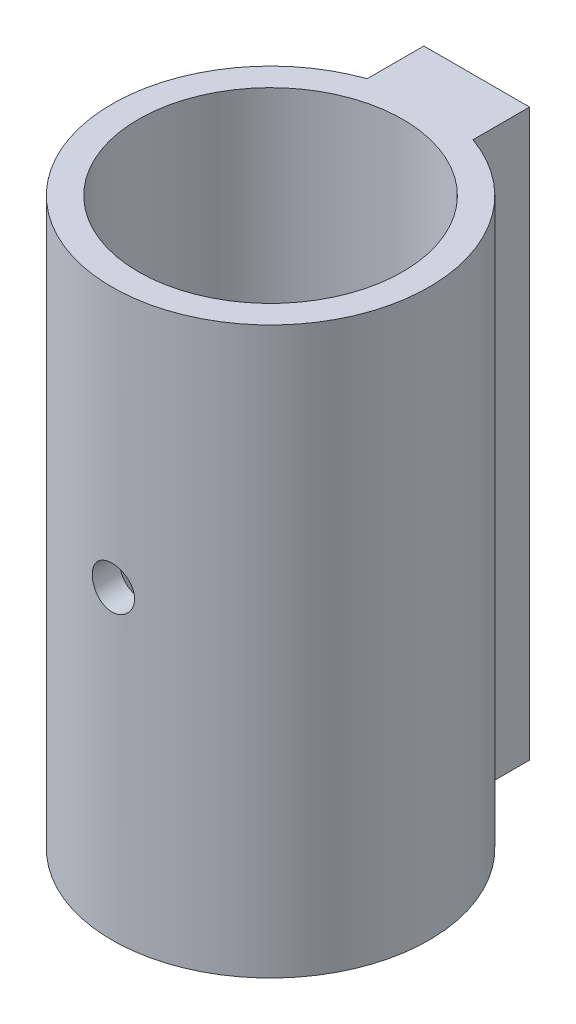
ISO-10303-21;
HEADER;
FILE_DESCRIPTION(('STEP AP214'),'2;1');
FILE_NAME('part.step','',(''),(''),'','','');
FILE_SCHEMA(('AUTOMOTIVE_DESIGN { 1 0 10303 214 1 1 1 1 }'));
ENDSEC;
DATA;
#1=APPLICATION_CONTEXT('core data for automotive mechanical design processes');
#2=APPLICATION_PROTOCOL_DEFINITION('international standard','automotive_design',2000,#1);
#3=PRODUCT_CONTEXT('',#1,'mechanical');
#4=PRODUCT('Part','Part','',(#3));
#5=PRODUCT_RELATED_PRODUCT_CATEGORY('part','',(#4));
#6=PRODUCT_DEFINITION_FORMATION('','',#4);
#7=PRODUCT_DEFINITION_CONTEXT('part definition',#1,'design');
#8=PRODUCT_DEFINITION('design','',#6,#7);
#9=PRODUCT_DEFINITION_SHAPE('','',#8);
#10=(LENGTH_UNIT() NAMED_UNIT(*) SI_UNIT(.MILLI.,.METRE.));
#11=(NAMED_UNIT(*) PLANE_ANGLE_UNIT() SI_UNIT($,.RADIAN.));
#12=(NAMED_UNIT(*) SI_UNIT($,.STERADIAN.) SOLID_ANGLE_UNIT());
#13=UNCERTAINTY_MEASURE_WITH_UNIT(LENGTH_MEASURE(1.E-05),#10,'distance_accuracy_value','');
#14=(GEOMETRIC_REPRESENTATION_CONTEXT(3) GLOBAL_UNCERTAINTY_ASSIGNED_CONTEXT((#13)) GLOBAL_UNIT_ASSIGNED_CONTEXT((#10,
#11,#12)) REPRESENTATION_CONTEXT('',''));
#15=CARTESIAN_POINT('',(0.,0.,0.));
#16=DIRECTION('',(0.,0.,1.));
#17=DIRECTION('',(1.,0.,0.));
#18=AXIS2_PLACEMENT_3D('',#15,#16,#17);
#19=CARTESIAN_POINT('',(0.,21.4,-7.8));
#20=DIRECTION('',(0.,0.,1.));
#21=DIRECTION('',(1.,0.,0.));
#22=AXIS2_PLACEMENT_3D('',#19,#20,#21);
#23=PLANE('',#22);
#24=CARTESIAN_POINT('',(0.,11.5544489743092,-7.8));
#25=DIRECTION('',(0.,0.,-1.));
#26=DIRECTION('',(-1.,0.,0.));
#27=AXIS2_PLACEMENT_3D('',#24,#25,#26);
#28=CIRCLE('',#27,1.99);
#29=CARTESIAN_POINT('',(-1.99,11.5544489743092,-7.8));
#30=VERTEX_POINT('',#29);
#31=EDGE_CURVE('E152',#30,#30,#28,.T.);
#32=ORIENTED_EDGE('',*,*,#31,.F.);
#33=EDGE_LOOP('',(#32));
#34=FACE_BOUND('',#33,.T.);
#35=DIRECTION('',(-1.,0.,0.));
#36=VECTOR('',#35,1.);
#37=CARTESIAN_POINT('',(0.,0.,-7.8));
#38=LINE('',#37,#36);
#39=CARTESIAN_POINT('',(2.,0.,-7.8));
#40=VERTEX_POINT('',#39);
#41=CARTESIAN_POINT('',(-2.,0.,-7.8));
#42=VERTEX_POINT('',#41);
#43=EDGE_CURVE('E88',#40,#42,#38,.T.);
#44=ORIENTED_EDGE('',*,*,#43,.T.);
#45=DIRECTION('',(0.,-1.,0.));
#46=VECTOR('',#45,1.);
#47=CARTESIAN_POINT('',(-2.,21.4,-7.8));
#48=LINE('',#47,#46);
#49=CARTESIAN_POINT('',(-2.,21.4,-7.8));
#50=VERTEX_POINT('',#49);
#51=EDGE_CURVE('E11',#50,#42,#48,.T.);
#52=ORIENTED_EDGE('',*,*,#51,.F.);
#53=DIRECTION('',(-1.,0.,0.));
#54=VECTOR('',#53,1.);
#55=CARTESIAN_POINT('',(0.,21.4,-7.8));
#56=LINE('',#55,#54);
#57=CARTESIAN_POINT('',(2.,21.4,-7.8));
#58=VERTEX_POINT('',#57);
#59=EDGE_CURVE('E93',#58,#50,#56,.T.);
#60=ORIENTED_EDGE('',*,*,#59,.F.);
#61=DIRECTION('',(0.,-1.,0.));
#62=VECTOR('',#61,1.);
#63=CARTESIAN_POINT('',(2.,21.4,-7.8));
#64=LINE('',#63,#62);
#65=EDGE_CURVE('E109',#58,#40,#64,.T.);
#66=ORIENTED_EDGE('',*,*,#65,.T.);
#67=EDGE_LOOP('',(#44,#52,#60,#66));
#68=FACE_BOUND('',#67,.T.);
#69=ADVANCED_FACE('F41',(#34,#68),#23,.F.);
#70=CARTESIAN_POINT('',(-2.,21.4,-7.8));
#71=DIRECTION('',(1.,0.,0.));
#72=DIRECTION('',(0.,0.,-1.));
#73=AXIS2_PLACEMENT_3D('',#70,#71,#72);
#74=PLANE('',#73);
#75=DIRECTION('',(0.,0.,1.));
#76=VECTOR('',#75,1.);
#77=CARTESIAN_POINT('',(-2.,0.,-7.8));
#78=LINE('',#77,#76);
#79=CARTESIAN_POINT('',(-2.,0.,-5.65685424949238));
#80=VERTEX_POINT('',#79);
#81=EDGE_CURVE('E104',#42,#80,#78,.T.);
#82=ORIENTED_EDGE('',*,*,#81,.T.);
#83=DIRECTION('',(0.,-1.,0.));
#84=VECTOR('',#83,1.);
#85=CARTESIAN_POINT('',(-2.,21.4,-5.65685424949238));
#86=LINE('',#85,#84);
#87=CARTESIAN_POINT('',(-2.,21.4,-5.65685424949238));
#88=VERTEX_POINT('',#87);
#89=EDGE_CURVE('E55',#88,#80,#86,.T.);
#90=ORIENTED_EDGE('',*,*,#89,.F.);
#91=DIRECTION('',(0.,0.,1.));
#92=VECTOR('',#91,1.);
#93=CARTESIAN_POINT('',(-2.,21.4,-7.8));
#94=LINE('',#93,#92);
#95=EDGE_CURVE('E96',#50,#88,#94,.T.);
#96=ORIENTED_EDGE('',*,*,#95,.F.);
#97=ORIENTED_EDGE('',*,*,#51,.T.);
#98=EDGE_LOOP('',(#82,#90,#96,#97));
#99=FACE_BOUND('',#98,.T.);
#100=ADVANCED_FACE('F103',(#99),#74,.F.);
#101=CARTESIAN_POINT('',(0.,21.4,0.));
#102=DIRECTION('',(0.,-1.,0.));
#103=DIRECTION('',(0.,0.,-1.));
#104=AXIS2_PLACEMENT_3D('',#101,#102,#103);
#105=CYLINDRICAL_SURFACE('',#104,6.);
#106=CARTESIAN_POINT('',(0.,10.7544489743092,6.));
#107=CARTESIAN_POINT('',(-0.0447235342677136,10.754450858192,5.99999934297018));
#108=CARTESIAN_POINT('',(-0.0894743917105119,10.7582119894942,5.99949468290877));
#109=CARTESIAN_POINT('',(-0.177729090055231,10.7731555139291,5.99753004450762));
#110=CARTESIAN_POINT('',(-0.221231608933214,10.7843454922681,5.99606908976689));
#111=CARTESIAN_POINT('',(-0.305699325050793,10.8138096613258,5.99235631939627));
#112=CARTESIAN_POINT('',(-0.346666273223397,10.8320788987246,5.99010505684389));
#113=CARTESIAN_POINT('',(-0.424945558012119,10.8751717398318,5.98506154664157));
#114=CARTESIAN_POINT('',(-0.46225848253481,10.8999942867758,5.98226938623426));
#115=CARTESIAN_POINT('',(-0.532410329001871,10.9556542789509,5.97643597915986));
#116=CARTESIAN_POINT('',(-0.565223194198345,10.9865244323126,5.97339343264844));
#117=CARTESIAN_POINT('',(-0.625218942692406,11.0533330499399,5.9674125502318));
#118=CARTESIAN_POINT('',(-0.652401527988885,11.0892717823076,5.96447421984937));
#119=CARTESIAN_POINT('',(-0.70046360907563,11.1653686234873,5.95902174176076));
#120=CARTESIAN_POINT('',(-0.721318429930311,11.2055424473007,5.95650927106305));
#121=CARTESIAN_POINT('',(-0.755975380029161,11.288861401204,5.95221034951693));
#122=CARTESIAN_POINT('',(-0.769777812981111,11.3320064032506,5.95042386740483));
#123=CARTESIAN_POINT('',(-0.789858427088695,11.4197712985099,5.94779174627467));
#124=CARTESIAN_POINT('',(-0.796180816914026,11.4643809081224,5.94694058148054));
#125=CARTESIAN_POINT('',(-0.801258722192469,11.5540354461516,5.94625860643726));
#126=CARTESIAN_POINT('',(-0.800014582534405,11.5990803546336,5.9464277496816));
#127=CARTESIAN_POINT('',(-0.790030983756938,11.6880174263204,5.94776222309196));
#128=CARTESIAN_POINT('',(-0.781340390127047,11.7319151862635,5.94892105848937));
#129=CARTESIAN_POINT('',(-0.756786898537486,11.8176237090133,5.95209421109898));
#130=CARTESIAN_POINT('',(-0.740923837045829,11.8594344242112,5.95410854781651));
#131=CARTESIAN_POINT('',(-0.702423716572765,11.9399328281921,5.9587730444441));
#132=CARTESIAN_POINT('',(-0.679765591654997,11.978610322787,5.9614251764956));
#133=CARTESIAN_POINT('',(-0.628333573377157,12.0516326070763,5.96706494487974));
#134=CARTESIAN_POINT('',(-0.59955936200954,12.0859771713309,5.97005259865412));
#135=CARTESIAN_POINT('',(-0.53644196010545,12.149642179342,5.97605559693434));
#136=CARTESIAN_POINT('',(-0.502056682810579,12.1789209113902,5.97907097416479));
#137=CARTESIAN_POINT('',(-0.428837668053363,12.2312977922806,5.98476769527305));
#138=CARTESIAN_POINT('',(-0.390003917776948,12.2543959233187,5.98744903818862));
#139=CARTESIAN_POINT('',(-0.308956887892188,12.2937566213871,5.99217757497432));
#140=CARTESIAN_POINT('',(-0.266742231536493,12.3100163867278,5.99422450883583));
#141=CARTESIAN_POINT('',(-0.1801483697345,12.3352047018982,5.99745130361628));
#142=CARTESIAN_POINT('',(-0.135769279816903,12.344133642565,5.99863121075972));
#143=CARTESIAN_POINT('',(-0.0464667613302583,12.3543523474177,5.99998496550743));
#144=CARTESIAN_POINT('',(-0.00155001381881778,12.3556995350226,6.00016637539618));
#145=CARTESIAN_POINT('',(0.0878686468874864,12.3508683086584,5.99952316615407));
#146=CARTESIAN_POINT('',(0.132370570138265,12.3446900775963,5.9986985714744));
#147=CARTESIAN_POINT('',(0.219525486229175,12.3250311129557,5.9961407014324));
#148=CARTESIAN_POINT('',(0.262184806604818,12.3115779469804,5.99441085721168));
#149=CARTESIAN_POINT('',(0.344642039517424,12.2777797879344,5.99023603701715));
#150=CARTESIAN_POINT('',(0.384439842806255,12.2574345319039,5.98779103375776));
#151=CARTESIAN_POINT('',(0.460299551446431,12.2102921120759,5.9824393494803));
#152=CARTESIAN_POINT('',(0.496338325758641,12.1834580280239,5.97953006018286));
#153=CARTESIAN_POINT('',(0.563421178796758,12.1241516426195,5.97358291483993));
#154=CARTESIAN_POINT('',(0.594465030649514,12.0916790853027,5.97054505296248));
#155=CARTESIAN_POINT('',(0.650882197692393,12.0217637172534,5.96465960989404));
#156=CARTESIAN_POINT('',(0.676217310435753,11.984289947614,5.96181339510119));
#157=CARTESIAN_POINT('',(0.720233404315256,11.9055852101969,5.95665653200727));
#158=CARTESIAN_POINT('',(0.738914534041386,11.8643543263451,5.95434587174714));
#159=CARTESIAN_POINT('',(0.769031346002985,11.7794260774982,5.95053124712031));
#160=CARTESIAN_POINT('',(0.780488115387182,11.7357363002249,5.94902493693039));
#161=CARTESIAN_POINT('',(0.795898668575835,11.6470315214577,5.94698299479317));
#162=CARTESIAN_POINT('',(0.799852853707127,11.6020165909795,5.94644731092537));
#163=CARTESIAN_POINT('',(0.800137943224758,11.5123195779678,5.94640892518179));
#164=CARTESIAN_POINT('',(0.796528876777971,11.4676376779235,5.94689808913008));
#165=CARTESIAN_POINT('',(0.781917506746757,11.3795218242677,5.94883673549679));
#166=CARTESIAN_POINT('',(0.770915205933074,11.3360878701885,5.95028621755532));
#167=CARTESIAN_POINT('',(0.741849241328829,11.2517115010086,5.95397956109105));
#168=CARTESIAN_POINT('',(0.723788883276164,11.2107679298625,5.9562230506376));
#169=CARTESIAN_POINT('',(0.681125371038949,11.1324826207788,5.96125218285129));
#170=CARTESIAN_POINT('',(0.656522090521714,11.0951409524068,5.96403783598641));
#171=CARTESIAN_POINT('',(0.601249794038033,11.0248131143379,5.96986386873225));
#172=CARTESIAN_POINT('',(0.570536108907603,10.9918621952072,5.97290602301633));
#173=CARTESIAN_POINT('',(0.504008677399294,10.9315596877646,5.97888687600665));
#174=CARTESIAN_POINT('',(0.46819373629191,10.9042094148091,5.98182555027591));
#175=CARTESIAN_POINT('',(0.392301195141128,10.8557821189226,5.98728254055012));
#176=CARTESIAN_POINT('',(0.352205848297585,10.8347327076871,5.98979898570756));
#177=CARTESIAN_POINT('',(0.26903696383493,10.7996967348912,5.99410928263589));
#178=CARTESIAN_POINT('',(0.225966671587955,10.7857026108593,5.99590390769725));
#179=CARTESIAN_POINT('',(0.152235363239367,10.7684697717552,5.99814288697306));
#180=CARTESIAN_POINT('',(0.122036432782311,10.7632196768998,5.9988358545403));
#181=CARTESIAN_POINT('',(0.0612292686464442,10.7562086486431,5.99976463396308));
#182=CARTESIAN_POINT('',(0.0306210385804959,10.7544476844638,6.0000004498512));
#183=CARTESIAN_POINT('',(0.,10.7544489743092,6.));
#184=B_SPLINE_CURVE_WITH_KNOTS('',3,(#106,#107,#108,#109,#110,#111,#112,#113,#114,#115,#116,
#117,#118,#119,#120,#121,#122,#123,#124,#125,#126,#127,#128,#129,#130,#131,#132,#133,#134,#135,
#136,#137,#138,#139,#140,#141,#142,#143,#144,#145,#146,#147,#148,#149,#150,#151,#152,#153,#154,
#155,#156,#157,#158,#159,#160,#161,#162,#163,#164,#165,#166,#167,#168,#169,#170,#171,#172,#173,
#174,#175,#176,#177,#178,#179,#180,#181,#182,#183),.UNSPECIFIED.,.T.,.F.,(4,2,2,2,2,2,2,2,2,2,2,
2,2,2,2,2,2,2,2,2,2,2,2,2,2,2,2,2,2,2,2,2,2,2,2,2,2,2,4),(0.,0.134058740522297,
0.268254572354018,0.402356677130961,0.536437170256137,0.671263913774235,0.806097791619343,
0.94145088604659,1.07679815106482,1.21134142365744,1.34587856369968,1.47953954039217,
1.6132035647034,1.74728633255159,1.88137607377519,2.0165221779394,2.15166867140918,
2.28687048081015,2.42206508156697,2.55623433996824,2.69040033741791,2.82406145358585,
2.95772767001418,3.09217309907954,3.22662463303505,3.3619508181418,3.49727398109219,
3.63220029894182,3.76711939913454,3.9009717099865,4.03482397067498,4.16861361481049,
4.30240584238361,4.43721467134043,4.57205512500464,4.70747810669806,4.84275561996967,
4.93454295618923,5.02632948274175),.UNSPECIFIED.);
#185=CARTESIAN_POINT('',(0.,10.7544489743092,6.));
#186=VERTEX_POINT('',#185);
#187=EDGE_CURVE('E144',#186,#186,#184,.T.);
#188=ORIENTED_EDGE('',*,*,#187,.T.);
#189=EDGE_LOOP('',(#188));
#190=FACE_BOUND('',#189,.T.);
#191=CARTESIAN_POINT('',(0.,0.,0.));
#192=DIRECTION('',(0.,1.,0.));
#193=DIRECTION('',(0.,0.,1.));
#194=AXIS2_PLACEMENT_3D('',#191,#192,#193);
#195=CIRCLE('',#194,6.);
#196=CARTESIAN_POINT('',(1.99999999999999,0.,-5.65685424949238));
#197=VERTEX_POINT('',#196);
#198=EDGE_CURVE('E81',#80,#197,#195,.T.);
#199=ORIENTED_EDGE('',*,*,#198,.T.);
#200=DIRECTION('',(0.,-1.,0.));
#201=VECTOR('',#200,1.);
#202=CARTESIAN_POINT('',(1.99999999999999,21.4,-5.65685424949238));
#203=LINE('',#202,#201);
#204=CARTESIAN_POINT('',(1.99999999999999,21.4,-5.65685424949238));
#205=VERTEX_POINT('',#204);
#206=EDGE_CURVE('E105',#205,#197,#203,.T.);
#207=ORIENTED_EDGE('',*,*,#206,.F.);
#208=CARTESIAN_POINT('',(0.,21.4,0.));
#209=DIRECTION('',(0.,1.,0.));
#210=DIRECTION('',(0.,0.,1.));
#211=AXIS2_PLACEMENT_3D('',#208,#209,#210);
#212=CIRCLE('',#211,6.);
#213=EDGE_CURVE('E100',#88,#205,#212,.T.);
#214=ORIENTED_EDGE('',*,*,#213,.F.);
#215=ORIENTED_EDGE('',*,*,#89,.T.);
#216=EDGE_LOOP('',(#199,#207,#214,#215));
#217=FACE_BOUND('',#216,.T.);
#218=ADVANCED_FACE('F107',(#190,#217),#105,.T.);
#219=CARTESIAN_POINT('',(2.,21.4,-7.8));
#220=DIRECTION('',(-1.,0.,0.));
#221=DIRECTION('',(0.,0.,1.));
#222=AXIS2_PLACEMENT_3D('',#219,#220,#221);
#223=PLANE('',#222);
#224=DIRECTION('',(0.,0.,-1.));
#225=VECTOR('',#224,1.);
#226=CARTESIAN_POINT('',(2.,0.,-7.8));
#227=LINE('',#226,#225);
#228=EDGE_CURVE('E117',#197,#40,#227,.T.);
#229=ORIENTED_EDGE('',*,*,#228,.T.);
#230=ORIENTED_EDGE('',*,*,#65,.F.);
#231=DIRECTION('',(0.,0.,-1.));
#232=VECTOR('',#231,1.);
#233=CARTESIAN_POINT('',(2.,21.4,-7.8));
#234=LINE('',#233,#232);
#235=EDGE_CURVE('E64',#205,#58,#234,.T.);
#236=ORIENTED_EDGE('',*,*,#235,.F.);
#237=ORIENTED_EDGE('',*,*,#206,.T.);
#238=EDGE_LOOP('',(#229,#230,#236,#237));
#239=FACE_BOUND('',#238,.T.);
#240=ADVANCED_FACE('F158',(#239),#223,.F.);
#241=CARTESIAN_POINT('',(0.,21.4,0.));
#242=DIRECTION('',(0.,1.,0.));
#243=DIRECTION('',(0.,0.,1.));
#244=AXIS2_PLACEMENT_3D('',#241,#242,#243);
#245=PLANE('',#244);
#246=CARTESIAN_POINT('',(0.,21.4,0.));
#247=DIRECTION('',(0.,1.,0.));
#248=DIRECTION('',(0.,0.,1.));
#249=AXIS2_PLACEMENT_3D('',#246,#247,#248);
#250=CIRCLE('',#249,5.);
#251=CARTESIAN_POINT('',(0.,21.4,5.));
#252=VERTEX_POINT('',#251);
#253=EDGE_CURVE('E123',#252,#252,#250,.T.);
#254=ORIENTED_EDGE('',*,*,#253,.F.);
#255=EDGE_LOOP('',(#254));
#256=FACE_BOUND('',#255,.T.);
#257=ORIENTED_EDGE('',*,*,#59,.T.);
#258=ORIENTED_EDGE('',*,*,#95,.T.);
#259=ORIENTED_EDGE('',*,*,#213,.T.);
#260=ORIENTED_EDGE('',*,*,#235,.T.);
#261=EDGE_LOOP('',(#257,#258,#259,#260));
#262=FACE_BOUND('',#261,.T.);
#263=ADVANCED_FACE('F98',(#256,#262),#245,.T.);
#264=CARTESIAN_POINT('',(0.,0.,0.));
#265=DIRECTION('',(0.,1.,0.));
#266=DIRECTION('',(0.,0.,1.));
#267=AXIS2_PLACEMENT_3D('',#264,#265,#266);
#268=PLANE('',#267);
#269=CARTESIAN_POINT('',(0.,0.,0.));
#270=DIRECTION('',(0.,1.,0.));
#271=DIRECTION('',(0.,0.,1.));
#272=AXIS2_PLACEMENT_3D('',#269,#270,#271);
#273=CIRCLE('',#272,5.);
#274=CARTESIAN_POINT('',(0.,0.,5.));
#275=VERTEX_POINT('',#274);
#276=EDGE_CURVE('E114',#275,#275,#273,.T.);
#277=ORIENTED_EDGE('',*,*,#276,.T.);
#278=EDGE_LOOP('',(#277));
#279=FACE_BOUND('',#278,.T.);
#280=ORIENTED_EDGE('',*,*,#43,.F.);
#281=ORIENTED_EDGE('',*,*,#228,.F.);
#282=ORIENTED_EDGE('',*,*,#198,.F.);
#283=ORIENTED_EDGE('',*,*,#81,.F.);
#284=EDGE_LOOP('',(#280,#281,#282,#283));
#285=FACE_BOUND('',#284,.T.);
#286=ADVANCED_FACE('F174',(#279,#285),#268,.F.);
#287=CARTESIAN_POINT('',(0.,-3.5,0.));
#288=DIRECTION('',(0.,1.,0.));
#289=DIRECTION('',(0.,0.,1.));
#290=AXIS2_PLACEMENT_3D('',#287,#288,#289);
#291=CYLINDRICAL_SURFACE('',#290,5.);
#292=CARTESIAN_POINT('',(0.,10.7544489743092,5.));
#293=CARTESIAN_POINT('',(0.0446308080511735,10.7544507857613,4.99999925368398));
#294=CARTESIAN_POINT('',(0.0892866095441338,10.7581964172265,4.99939618705492));
#295=CARTESIAN_POINT('',(0.177347511863295,10.7730747533884,4.99704849367426));
#296=CARTESIAN_POINT('',(0.220751394454069,10.7842144158693,4.99530279172417));
#297=CARTESIAN_POINT('',(0.305021508450515,10.8135373264876,4.99086578560516));
#298=CARTESIAN_POINT('',(0.345889721177603,10.8317149927576,4.98817523095935));
#299=CARTESIAN_POINT('',(0.423990337738186,10.8745836920684,4.98214495920462));
#300=CARTESIAN_POINT('',(0.461223193179573,10.8992739146627,4.97880532288341));
#301=CARTESIAN_POINT('',(0.531330998418697,10.9546992160142,4.97181457161351));
#302=CARTESIAN_POINT('',(0.564169146610388,10.9854805658873,4.96816120177215));
#303=CARTESIAN_POINT('',(0.624237641135132,11.0521147612192,4.96097215963753));
#304=CARTESIAN_POINT('',(0.651467646762836,11.0879679145767,4.95743649450599));
#305=CARTESIAN_POINT('',(0.699692661652856,11.1639785287701,4.95086133431278));
#306=CARTESIAN_POINT('',(0.720651599384386,11.2041591492539,4.94782475339399));
#307=CARTESIAN_POINT('',(0.755508923850426,11.2875272394568,4.9426226637982));
#308=CARTESIAN_POINT('',(0.769407749272036,11.3307145221642,4.94045710100136));
#309=CARTESIAN_POINT('',(0.78963503472531,11.4184811250552,4.93726457896945));
#310=CARTESIAN_POINT('',(0.796026817801601,11.4630454986893,4.93622810120145));
#311=CARTESIAN_POINT('',(0.801254845350307,11.5526253691434,4.93538226863644));
#312=CARTESIAN_POINT('',(0.80009158277677,11.597640836339,4.93557283377695));
#313=CARTESIAN_POINT('',(0.790294188232538,11.6863949865088,4.93715085922415));
#314=CARTESIAN_POINT('',(0.781730938905658,11.7301417252537,4.93852696316707));
#315=CARTESIAN_POINT('',(0.757487774055361,11.8155694027484,4.94230325280695));
#316=CARTESIAN_POINT('',(0.741807631982687,11.8572502756896,4.944703471104));
#317=CARTESIAN_POINT('',(0.703703154988825,11.9375766814516,4.9502699273064));
#318=CARTESIAN_POINT('',(0.681249143270036,11.9762078941834,4.95343952372276));
#319=CARTESIAN_POINT('',(0.63025541052945,12.0491810829834,4.96018523245969));
#320=CARTESIAN_POINT('',(0.601715236062146,12.0835227391585,4.96376137506045));
#321=CARTESIAN_POINT('',(0.538971936351567,12.1473524944842,4.97096724981016));
#322=CARTESIAN_POINT('',(0.504707942182395,12.1767807771368,4.97459712801084));
#323=CARTESIAN_POINT('',(0.431696149872208,12.2294788698464,4.98146370833866));
#324=CARTESIAN_POINT('',(0.392948326886552,12.2527486457773,4.98470040828701));
#325=CARTESIAN_POINT('',(0.312014355323648,12.2924736455548,4.99042002279776));
#326=CARTESIAN_POINT('',(0.269825706968613,12.3089238612168,4.99290238302826));
#327=CARTESIAN_POINT('',(0.183235933575908,12.3344887174796,4.9968291023744));
#328=CARTESIAN_POINT('',(0.138834979228292,12.3436039230841,4.99827354143846));
#329=CARTESIAN_POINT('',(0.0495968221607879,12.3541595623144,4.99995098582024));
#330=CARTESIAN_POINT('',(0.00476957346417514,12.3556821606923,5.00019695987027));
#331=CARTESIAN_POINT('',(-0.0844997486044574,12.3512280216655,4.99948519003732));
#332=CARTESIAN_POINT('',(-0.128941835541716,12.3452515494647,4.9985274887222));
#333=CARTESIAN_POINT('',(-0.215927519294203,12.3260372550335,4.99552400060935));
#334=CARTESIAN_POINT('',(-0.258480269760833,12.3128398441874,4.99348427121022));
#335=CARTESIAN_POINT('',(-0.340769196234398,12.2796011868972,4.98854458459104));
#336=CARTESIAN_POINT('',(-0.380505224396477,12.259559581534,4.98564458225813));
#337=CARTESIAN_POINT('',(-0.456391460451548,12.2130113745879,4.9792740860737));
#338=CARTESIAN_POINT('',(-0.492509601238281,12.1864531199,4.97579911023324));
#339=CARTESIAN_POINT('',(-0.559805662558114,12.1276969125642,4.96867838165483));
#340=CARTESIAN_POINT('',(-0.590983253761131,12.0954985842579,4.96503261755335));
#341=CARTESIAN_POINT('',(-0.647815466120003,12.0260088190677,4.95793961092294));
#342=CARTESIAN_POINT('',(-0.67341474965888,11.9886718627945,4.95449458581512));
#343=CARTESIAN_POINT('',(-0.717977956840478,11.9101794618611,4.94823364120698));
#344=CARTESIAN_POINT('',(-0.736942078495341,11.8690241311984,4.94541770293382));
#345=CARTESIAN_POINT('',(-0.767612633416616,11.784222190622,4.94075016481912));
#346=CARTESIAN_POINT('',(-0.779347259610064,11.7405859924701,4.9388948235089));
#347=CARTESIAN_POINT('',(-0.795314874217839,11.6519299463124,4.93634892888289));
#348=CARTESIAN_POINT('',(-0.799548458993818,11.6069102085929,4.93565828296954));
#349=CARTESIAN_POINT('',(-0.800378186473576,11.5173171769346,4.93552375034277));
#350=CARTESIAN_POINT('',(-0.797061391285785,11.4727446864933,4.93606565128661));
#351=CARTESIAN_POINT('',(-0.7830720718919,11.3848004452584,4.93830411303284));
#352=CARTESIAN_POINT('',(-0.772399566311448,11.3414286914245,4.9400006709115));
#353=CARTESIAN_POINT('',(-0.744034087420252,11.2571468343027,4.94435206344804));
#354=CARTESIAN_POINT('',(-0.726348031080533,11.2162343512527,4.94700595372412));
#355=CARTESIAN_POINT('',(-0.684466309136973,11.13794318724,4.95297399069632));
#356=CARTESIAN_POINT('',(-0.660270362498028,11.100564658934,4.95628816589566));
#357=CARTESIAN_POINT('',(-0.605742654398707,11.0299615419746,4.96324867230805));
#358=CARTESIAN_POINT('',(-0.575346658323837,10.9967868751491,4.96689824087121));
#359=CARTESIAN_POINT('',(-0.509417337431812,10.9359788217502,4.97409200519902));
#360=CARTESIAN_POINT('',(-0.473882825608019,10.9083467190498,4.97763617638799));
#361=CARTESIAN_POINT('',(-0.398419338630934,10.8592499878405,4.98424562251661));
#362=CARTESIAN_POINT('',(-0.358464019917939,10.8378254247543,4.98730773061183));
#363=CARTESIAN_POINT('',(-0.275490066787462,10.8020244571496,4.99257715001872));
#364=CARTESIAN_POINT('',(-0.232474584483901,10.7876409170677,4.99478532624932));
#365=CARTESIAN_POINT('',(-0.157734207535215,10.7695106788151,4.99760702358556));
#366=CARTESIAN_POINT('',(-0.126465390999476,10.7638714131921,4.9984996711327));
#367=CARTESIAN_POINT('',(-0.063468592060681,10.7563399451638,4.99969642026856));
#368=CARTESIAN_POINT('',(-0.0317406166155308,10.7544476860376,5.00000053076634));
#369=CARTESIAN_POINT('',(0.,10.7544489743092,5.));
#370=B_SPLINE_CURVE_WITH_KNOTS('',3,(#292,#293,#294,#295,#296,#297,#298,#299,#300,#301,#302,
#303,#304,#305,#306,#307,#308,#309,#310,#311,#312,#313,#314,#315,#316,#317,#318,#319,#320,#321,
#322,#323,#324,#325,#326,#327,#328,#329,#330,#331,#332,#333,#334,#335,#336,#337,#338,#339,#340,
#341,#342,#343,#344,#345,#346,#347,#348,#349,#350,#351,#352,#353,#354,#355,#356,#357,#358,#359,
#360,#361,#362,#363,#364,#365,#366,#367,#368,#369),.UNSPECIFIED.,.T.,.F.,(4,2,2,2,2,2,2,2,2,2,2,
2,2,2,2,2,2,2,2,2,2,2,2,2,2,2,2,2,2,2,2,2,2,2,2,2,2,2,4),(0.,0.133776418649178,
0.267678899727787,0.401475399062742,0.535255256116415,0.670093338432935,0.804939610005121,
0.940547238503781,1.07614643985655,1.2105934338786,1.34503165554811,1.478196223562,
1.61136503084877,1.74512594827327,1.87889683494994,2.01419325334956,2.14949042145488,
2.28488677454407,2.42027269728078,2.55419028860046,2.68810314407254,2.82127412090819,
2.95445208248902,3.08872183713538,3.22300053825308,3.35855610834642,3.49410763273008,
3.62912714304125,3.76413591830011,3.89759582738457,4.03105539853193,4.16438367394705,
4.29771770613194,4.43251052341618,4.56733452797894,4.70301027460094,4.83854823761406,
4.93368902667994,5.0288283755278),.UNSPECIFIED.);
#371=CARTESIAN_POINT('',(0.,10.7544489743092,5.));
#372=VERTEX_POINT('',#371);
#373=EDGE_CURVE('E44',#372,#372,#370,.T.);
#374=ORIENTED_EDGE('',*,*,#373,.T.);
#375=EDGE_LOOP('',(#374));
#376=FACE_BOUND('',#375,.T.);
#377=CARTESIAN_POINT('',(-0.8,11.5544489743092,-4.93558507170123));
#378=CARTESIAN_POINT('',(-0.799998185073415,11.5990756604524,-4.93558585473547));
#379=CARTESIAN_POINT('',(-0.796253222084038,11.6437273506461,-4.93619688733531));
#380=CARTESIAN_POINT('',(-0.781377782006165,11.7317797132344,-4.93857300521684));
#381=CARTESIAN_POINT('',(-0.770240332080276,11.7751791641086,-4.9403391800437));
#382=CARTESIAN_POINT('',(-0.740923891747527,11.8594398995542,-4.94482054000623));
#383=CARTESIAN_POINT('',(-0.722750587703296,11.9003032029685,-4.94753495860065));
#384=CARTESIAN_POINT('',(-0.679892166593984,11.9783955664634,-4.95360605163724));
#385=CARTESIAN_POINT('',(-0.65520784958024,12.0156250722833,-4.95696264715696));
#386=CARTESIAN_POINT('',(-0.599788560945846,12.0857365474277,-4.96397400342678));
#387=CARTESIAN_POINT('',(-0.569005994830318,12.1185806805133,-4.96763096787548));
#388=CARTESIAN_POINT('',(-0.502366839260943,12.1786607581732,-4.97481140064582));
#389=CARTESIAN_POINT('',(-0.466509958388678,12.2058963804295,-4.97833486128556));
#390=CARTESIAN_POINT('',(-0.390495966811721,12.2541273588259,-4.98487450432198));
#391=CARTESIAN_POINT('',(-0.350316337789535,12.2750876504445,-4.98788779685135));
#392=CARTESIAN_POINT('',(-0.266950398356383,12.3099477499332,-4.99304311049062));
#393=CARTESIAN_POINT('',(-0.223764268468985,12.3238479813055,-4.99518518385959));
#394=CARTESIAN_POINT('',(-0.136001651578425,12.3440780720542,-4.99834115266823));
#395=CARTESIAN_POINT('',(-0.0914401453437614,12.3504714220713,-4.99936450470397));
#396=CARTESIAN_POINT('',(-0.00186592300889959,12.3557035775435,-5.0002001847064));
#397=CARTESIAN_POINT('',(0.0431467645452054,12.3545428579672,-5.00001258881248));
#398=CARTESIAN_POINT('',(0.131911886391414,12.3447495800352,-4.99845502458808));
#399=CARTESIAN_POINT('',(0.175672074928567,12.3361853406103,-4.99709586763407));
#400=CARTESIAN_POINT('',(0.261126137099071,12.3119355684594,-4.99335994390295));
#401=CARTESIAN_POINT('',(0.302819951691273,12.2962498323855,-4.99098314806818));
#402=CARTESIAN_POINT('',(0.383162394563616,12.2581335908292,-4.98546052013802));
#403=CARTESIAN_POINT('',(0.421797317397536,12.2356746833509,-4.98231146029853));
#404=CARTESIAN_POINT('',(0.494775868628133,12.1846704028624,-4.97559462459779));
#405=CARTESIAN_POINT('',(0.529119176053387,12.1561245750409,-4.97202681745692));
#406=CARTESIAN_POINT('',(0.592942886294144,12.0933771488851,-4.96482262808635));
#407=CARTESIAN_POINT('',(0.6223646032864,12.0591158639729,-4.96118592518751));
#408=CARTESIAN_POINT('',(0.675050723309765,11.9861118718005,-4.95429255402911));
#409=CARTESIAN_POINT('',(0.698315077825786,11.9473691292335,-4.95103588876406));
#410=CARTESIAN_POINT('',(0.73803612650917,11.8664367703264,-4.94527126199405));
#411=CARTESIAN_POINT('',(0.754486181687675,11.8242438402467,-4.94276403130193));
#412=CARTESIAN_POINT('',(0.78004941604778,11.7376447256519,-4.93879457567579));
#413=CARTESIAN_POINT('',(0.789163187678042,11.6932387201635,-4.93733226635919));
#414=CARTESIAN_POINT('',(0.799713399990516,11.6039978452399,-4.93563441966907));
#415=CARTESIAN_POINT('',(0.801233305499682,11.5591730884355,-4.9353855460576));
#416=CARTESIAN_POINT('',(0.796774670192981,11.469909387803,-4.93610727492225));
#417=CARTESIAN_POINT('',(0.790796395388185,11.4254704303442,-4.93707783413686));
#418=CARTESIAN_POINT('',(0.771582110819443,11.3385022121315,-4.94011677879918));
#419=CARTESIAN_POINT('',(0.758388213376963,11.2959634050369,-4.94217879200386));
#420=CARTESIAN_POINT('',(0.725161227645424,11.2137008195026,-4.94716299895283));
#421=CARTESIAN_POINT('',(0.705127759316019,11.1739771976365,-4.95008524049442));
#422=CARTESIAN_POINT('',(0.658591860869649,11.0981000170767,-4.95649180721202));
#423=CARTESIAN_POINT('',(0.632035720375422,11.0619797928812,-4.95998071331545));
#424=CARTESIAN_POINT('',(0.573282416990779,10.9946785500545,-4.96711393660611));
#425=CARTESIAN_POINT('',(0.541084889565665,10.9634978508532,-4.97075826382481));
#426=CARTESIAN_POINT('',(0.471593901952486,10.9066580574721,-4.97783368328296));
#427=CARTESIAN_POINT('',(0.434254752917196,10.8810544826649,-4.98126240933244));
#428=CARTESIAN_POINT('',(0.355756738955422,10.8364837559138,-4.98748283986874));
#429=CARTESIAN_POINT('',(0.314597989990529,10.8175164025801,-4.99027456368579));
#430=CARTESIAN_POINT('',(0.229797510837734,10.7868438847018,-4.99489611998971));
#431=CARTESIAN_POINT('',(0.18616670523943,10.7751091318148,-4.99672986677083));
#432=CARTESIAN_POINT('',(0.0975221020879298,10.7591394397522,-4.99924535633415));
#433=CARTESIAN_POINT('',(0.0525084093030922,10.7549039338476,-4.99992718616821));
#434=CARTESIAN_POINT('',(-0.0370872642982868,10.7540682550775,-5.00006093539052));
#435=CARTESIAN_POINT('',(-0.0816684579131953,10.7573834145481,-4.9995264932218));
#436=CARTESIAN_POINT('',(-0.169630532454886,10.771372509618,-4.99731544898762));
#437=CARTESIAN_POINT('',(-0.213011418856087,10.7820464116494,-4.99563885213226));
#438=CARTESIAN_POINT('',(-0.297312849245195,10.8104185042404,-4.9913311157785));
#439=CARTESIAN_POINT('',(-0.33823568092993,10.8281100431286,-4.98870088038931));
#440=CARTESIAN_POINT('',(-0.41654527932214,10.8700059584607,-4.98277371983535));
#441=CARTESIAN_POINT('',(-0.453931899790396,10.8942106040937,-4.9794767671163));
#442=CARTESIAN_POINT('',(-0.524535556587548,10.9487483024634,-4.97253818557739));
#443=CARTESIAN_POINT('',(-0.557704213276186,10.9791435755055,-4.96889327467274));
#444=CARTESIAN_POINT('',(-0.618500476330208,11.045068921853,-4.96169293810507));
#445=CARTESIAN_POINT('',(-0.646126782587254,11.0806001965915,-4.95813753360885));
#446=CARTESIAN_POINT('',(-0.695216766947158,11.1560606438822,-4.95149402021015));
#447=CARTESIAN_POINT('',(-0.716639464440323,11.1960167544334,-4.94840907975936));
#448=CARTESIAN_POINT('',(-0.7524367295698,11.2789922901963,-4.94309308858453));
#449=CARTESIAN_POINT('',(-0.766818451370864,11.3220085549315,-4.94086117163202));
#450=CARTESIAN_POINT('',(-0.784943942649537,11.3967441575544,-4.93800748018891));
#451=CARTESIAN_POINT('',(-0.790581080454431,11.4280070916966,-4.93710403046998));
#452=CARTESIAN_POINT('',(-0.798109724682128,11.4909921321347,-4.93589255254274));
#453=CARTESIAN_POINT('',(-0.800001290623034,11.5227142311262,-4.93558451487318));
#454=CARTESIAN_POINT('',(-0.8,11.5544489743092,-4.93558507170123));
#455=B_SPLINE_CURVE_WITH_KNOTS('',3,(#377,#378,#379,#380,#381,#382,#383,#384,#385,#386,#387,
#388,#389,#390,#391,#392,#393,#394,#395,#396,#397,#398,#399,#400,#401,#402,#403,#404,#405,#406,
#407,#408,#409,#410,#411,#412,#413,#414,#415,#416,#417,#418,#419,#420,#421,#422,#423,#424,#425,
#426,#427,#428,#429,#430,#431,#432,#433,#434,#435,#436,#437,#438,#439,#440,#441,#442,#443,#444,
#445,#446,#447,#448,#449,#450,#451,#452,#453,#454),.UNSPECIFIED.,.T.,.F.,(4,2,2,2,2,2,2,2,2,2,2,
2,2,2,2,2,2,2,2,2,2,2,2,2,2,2,2,2,2,2,2,2,2,2,2,2,2,2,4),(0.,0.133764032978236,
0.267654416240316,0.401436814708979,0.53520278209898,0.670057077330426,0.80491912040327,
0.940521238000383,1.07611522045936,1.21055394043864,1.34498420755128,1.47818704938263,
1.61139369493982,1.74516687269947,1.87895004942165,2.01422953733835,2.14951009111741,
2.28492213686848,2.42032324619167,2.55423282532143,2.68813765390886,2.82126919083117,
2.95440812640361,3.08868247170646,3.22296549674049,3.35852970160144,3.49408979213061,
3.62909156425651,3.76408313366813,3.89756846817801,4.03105319378109,4.16441169698711,
4.29777571279495,4.43255288424274,4.56736163445246,4.70304160363671,4.83858342408627,
4.93370665764446,5.0288283796578),.UNSPECIFIED.);
#456=CARTESIAN_POINT('',(-0.8,11.5544489743092,-4.93558507170123));
#457=VERTEX_POINT('',#456);
#458=EDGE_CURVE('E124',#457,#457,#455,.T.);
#459=ORIENTED_EDGE('',*,*,#458,.T.);
#460=EDGE_LOOP('',(#459));
#461=FACE_BOUND('',#460,.T.);
#462=ORIENTED_EDGE('',*,*,#253,.T.);
#463=EDGE_LOOP('',(#462));
#464=FACE_BOUND('',#463,.T.);
#465=ORIENTED_EDGE('',*,*,#276,.F.);
#466=EDGE_LOOP('',(#465));
#467=FACE_BOUND('',#466,.T.);
#468=ADVANCED_FACE('F130',(#376,#461,#464,#467),#291,.F.);
#469=CARTESIAN_POINT('',(0.,11.5544489743092,-5.8));
#470=DIRECTION('',(0.,0.,-1.));
#471=DIRECTION('',(-1.,0.,0.));
#472=AXIS2_PLACEMENT_3D('',#469,#470,#471);
#473=CYLINDRICAL_SURFACE('',#472,1.99);
#474=CARTESIAN_POINT('',(0.,11.5544489743092,-5.8));
#475=DIRECTION('',(0.,0.,-1.));
#476=DIRECTION('',(-1.,0.,0.));
#477=AXIS2_PLACEMENT_3D('',#474,#475,#476);
#478=CIRCLE('',#477,1.99);
#479=CARTESIAN_POINT('',(-1.99,11.5544489743092,-5.8));
#480=VERTEX_POINT('',#479);
#481=EDGE_CURVE('E153',#480,#480,#478,.T.);
#482=ORIENTED_EDGE('',*,*,#481,.F.);
#483=EDGE_LOOP('',(#482));
#484=FACE_BOUND('',#483,.T.);
#485=ORIENTED_EDGE('',*,*,#31,.T.);
#486=EDGE_LOOP('',(#485));
#487=FACE_BOUND('',#486,.T.);
#488=ADVANCED_FACE('F183',(#484,#487),#473,.F.);
#489=CARTESIAN_POINT('',(0.,11.5544489743092,-5.8));
#490=DIRECTION('',(0.,0.,-1.));
#491=DIRECTION('',(-1.,0.,0.));
#492=AXIS2_PLACEMENT_3D('',#489,#490,#491);
#493=PLANE('',#492);
#494=CARTESIAN_POINT('',(0.,11.5544489743092,-5.8));
#495=DIRECTION('',(0.,0.,-1.));
#496=DIRECTION('',(-1.,0.,0.));
#497=AXIS2_PLACEMENT_3D('',#494,#495,#496);
#498=CIRCLE('',#497,0.8);
#499=CARTESIAN_POINT('',(-0.8,11.5544489743092,-5.8));
#500=VERTEX_POINT('',#499);
#501=EDGE_CURVE('E129',#500,#500,#498,.T.);
#502=ORIENTED_EDGE('',*,*,#501,.F.);
#503=EDGE_LOOP('',(#502));
#504=FACE_BOUND('',#503,.T.);
#505=ORIENTED_EDGE('',*,*,#481,.T.);
#506=EDGE_LOOP('',(#505));
#507=FACE_BOUND('',#506,.T.);
#508=ADVANCED_FACE('F140',(#504,#507),#493,.T.);
#509=CARTESIAN_POINT('',(0.,11.5544489743092,6.));
#510=DIRECTION('',(0.,0.,-1.));
#511=DIRECTION('',(-1.,0.,0.));
#512=AXIS2_PLACEMENT_3D('',#509,#510,#511);
#513=CYLINDRICAL_SURFACE('',#512,0.8);
#514=ORIENTED_EDGE('',*,*,#501,.T.);
#515=EDGE_LOOP('',(#514));
#516=FACE_BOUND('',#515,.T.);
#517=ORIENTED_EDGE('',*,*,#458,.F.);
#518=EDGE_LOOP('',(#517));
#519=FACE_BOUND('',#518,.T.);
#520=ADVANCED_FACE('F138',(#516,#519),#513,.F.);
#521=ORIENTED_EDGE('',*,*,#373,.F.);
#522=EDGE_LOOP('',(#521));
#523=FACE_BOUND('',#522,.T.);
#524=ORIENTED_EDGE('',*,*,#187,.F.);
#525=EDGE_LOOP('',(#524));
#526=FACE_BOUND('',#525,.T.);
#527=ADVANCED_FACE('F134',(#523,#526),#513,.F.);
#528=CLOSED_SHELL('',(#69,#100,#218,#240,#263,#286,#468,#488,#508,#520,#527));
#529=MANIFOLD_SOLID_BREP('B2',#528);
#530=ADVANCED_BREP_SHAPE_REPRESENTATION('',(#18,#529),#14);
#531=SHAPE_DEFINITION_REPRESENTATION(#9,#530);
ENDSEC;
END-ISO-10303-21;
